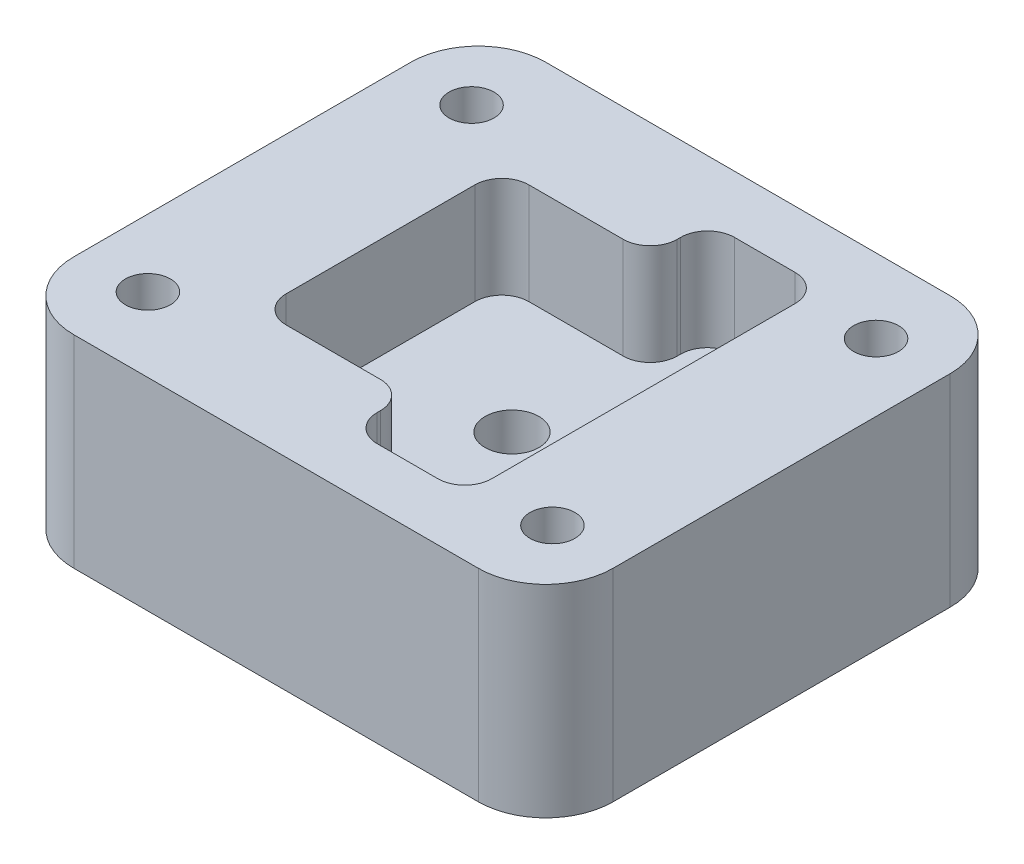
ISO-10303-21;
HEADER;
FILE_DESCRIPTION(('STEP AP214'),'2;1');
FILE_NAME('part.step','',(''),(''),'','','');
FILE_SCHEMA(('AUTOMOTIVE_DESIGN { 1 0 10303 214 1 1 1 1 }'));
ENDSEC;
DATA;
#1=APPLICATION_CONTEXT('core data for automotive mechanical design processes');
#2=APPLICATION_PROTOCOL_DEFINITION('international standard','automotive_design',2000,#1);
#3=PRODUCT_CONTEXT('',#1,'mechanical');
#4=PRODUCT('Part','Part','',(#3));
#5=PRODUCT_RELATED_PRODUCT_CATEGORY('part','',(#4));
#6=PRODUCT_DEFINITION_FORMATION('','',#4);
#7=PRODUCT_DEFINITION_CONTEXT('part definition',#1,'design');
#8=PRODUCT_DEFINITION('design','',#6,#7);
#9=PRODUCT_DEFINITION_SHAPE('','',#8);
#10=(LENGTH_UNIT() NAMED_UNIT(*) SI_UNIT(.MILLI.,.METRE.));
#11=(NAMED_UNIT(*) PLANE_ANGLE_UNIT() SI_UNIT($,.RADIAN.));
#12=(NAMED_UNIT(*) SI_UNIT($,.STERADIAN.) SOLID_ANGLE_UNIT());
#13=UNCERTAINTY_MEASURE_WITH_UNIT(LENGTH_MEASURE(1.E-05),#10,'distance_accuracy_value','');
#14=(GEOMETRIC_REPRESENTATION_CONTEXT(3) GLOBAL_UNCERTAINTY_ASSIGNED_CONTEXT((#13)) GLOBAL_UNIT_ASSIGNED_CONTEXT((#10,
#11,#12)) REPRESENTATION_CONTEXT('',''));
#15=CARTESIAN_POINT('',(0.,0.,0.));
#16=DIRECTION('',(0.,0.,1.));
#17=DIRECTION('',(1.,0.,0.));
#18=AXIS2_PLACEMENT_3D('',#15,#16,#17);
#19=CARTESIAN_POINT('',(20.,0.,-17.5));
#20=DIRECTION('',(0.,1.,0.));
#21=DIRECTION('',(0.,0.,1.));
#22=AXIS2_PLACEMENT_3D('',#19,#20,#21);
#23=CYLINDRICAL_SURFACE('',#22,2.);
#24=CARTESIAN_POINT('',(20.,7.5,-17.5));
#25=DIRECTION('',(0.,1.,0.));
#26=DIRECTION('',(0.,0.,1.));
#27=AXIS2_PLACEMENT_3D('',#24,#25,#26);
#28=CIRCLE('',#27,2.);
#29=CARTESIAN_POINT('',(20.,7.5,-15.5));
#30=VERTEX_POINT('',#29);
#31=EDGE_CURVE('E773',#30,#30,#28,.T.);
#32=ORIENTED_EDGE('',*,*,#31,.T.);
#33=EDGE_LOOP('',(#32));
#34=FACE_BOUND('',#33,.T.);
#35=CARTESIAN_POINT('',(20.,2.5,-17.5));
#36=DIRECTION('',(0.,-1.,0.));
#37=DIRECTION('',(0.,0.,-1.));
#38=AXIS2_PLACEMENT_3D('',#35,#36,#37);
#39=CIRCLE('',#38,2.);
#40=CARTESIAN_POINT('',(20.,2.5,-19.5));
#41=VERTEX_POINT('',#40);
#42=EDGE_CURVE('E42',#41,#41,#39,.F.);
#43=ORIENTED_EDGE('',*,*,#42,.F.);
#44=EDGE_LOOP('',(#43));
#45=FACE_BOUND('',#44,.T.);
#46=ADVANCED_FACE('F38',(#34,#45),#23,.F.);
#47=CARTESIAN_POINT('',(0.,15.,0.));
#48=DIRECTION('',(0.,-1.,0.));
#49=DIRECTION('',(0.,0.,-1.));
#50=AXIS2_PLACEMENT_3D('',#47,#48,#49);
#51=PLANE('',#50);
#52=DIRECTION('',(0.,0.,1.));
#53=VECTOR('',#52,1.);
#54=CARTESIAN_POINT('',(21.25,15.,-8.5));
#55=LINE('',#54,#53);
#56=CARTESIAN_POINT('',(21.25,15.,-6.5));
#57=VERTEX_POINT('',#56);
#58=CARTESIAN_POINT('',(21.25,15.,-6.25000000000003));
#59=VERTEX_POINT('',#58);
#60=EDGE_CURVE('E413',#57,#59,#55,.T.);
#61=ORIENTED_EDGE('',*,*,#60,.F.);
#62=CARTESIAN_POINT('',(19.25,15.,-6.5));
#63=DIRECTION('',(0.,-1.,0.));
#64=DIRECTION('',(0.,0.,-1.));
#65=AXIS2_PLACEMENT_3D('',#62,#63,#64);
#66=CIRCLE('',#65,2.);
#67=CARTESIAN_POINT('',(19.25,15.,-8.5));
#68=VERTEX_POINT('',#67);
#69=EDGE_CURVE('E364',#57,#68,#66,.F.);
#70=ORIENTED_EDGE('',*,*,#69,.T.);
#71=DIRECTION('',(1.,0.,0.));
#72=VECTOR('',#71,1.);
#73=CARTESIAN_POINT('',(10.25,15.,-8.5));
#74=LINE('',#73,#72);
#75=CARTESIAN_POINT('',(12.25,15.,-8.5));
#76=VERTEX_POINT('',#75);
#77=EDGE_CURVE('E412',#76,#68,#74,.T.);
#78=ORIENTED_EDGE('',*,*,#77,.F.);
#79=CARTESIAN_POINT('',(12.25,15.,-10.5));
#80=DIRECTION('',(0.,-1.,0.));
#81=DIRECTION('',(0.,0.,-1.));
#82=AXIS2_PLACEMENT_3D('',#79,#80,#81);
#83=CIRCLE('',#82,2.);
#84=CARTESIAN_POINT('',(10.25,15.,-10.5));
#85=VERTEX_POINT('',#84);
#86=EDGE_CURVE('E376',#76,#85,#83,.T.);
#87=ORIENTED_EDGE('',*,*,#86,.T.);
#88=DIRECTION('',(0.,0.,1.));
#89=VECTOR('',#88,1.);
#90=CARTESIAN_POINT('',(10.25,15.,-26.5));
#91=LINE('',#90,#89);
#92=CARTESIAN_POINT('',(10.25,15.,-24.5));
#93=VERTEX_POINT('',#92);
#94=EDGE_CURVE('E418',#93,#85,#91,.T.);
#95=ORIENTED_EDGE('',*,*,#94,.F.);
#96=CARTESIAN_POINT('',(12.25,15.,-24.5));
#97=DIRECTION('',(0.,-1.,0.));
#98=DIRECTION('',(0.,0.,-1.));
#99=AXIS2_PLACEMENT_3D('',#96,#97,#98);
#100=CIRCLE('',#99,2.);
#101=CARTESIAN_POINT('',(12.25,15.,-26.5));
#102=VERTEX_POINT('',#101);
#103=EDGE_CURVE('E373',#93,#102,#100,.T.);
#104=ORIENTED_EDGE('',*,*,#103,.T.);
#105=DIRECTION('',(-1.,0.,0.));
#106=VECTOR('',#105,1.);
#107=CARTESIAN_POINT('',(21.25,15.,-26.5));
#108=LINE('',#107,#106);
#109=CARTESIAN_POINT('',(19.25,15.,-26.5));
#110=VERTEX_POINT('',#109);
#111=EDGE_CURVE('E425',#110,#102,#108,.T.);
#112=ORIENTED_EDGE('',*,*,#111,.F.);
#113=CARTESIAN_POINT('',(19.25,15.,-28.5));
#114=DIRECTION('',(0.,-1.,0.));
#115=DIRECTION('',(0.,0.,-1.));
#116=AXIS2_PLACEMENT_3D('',#113,#114,#115);
#117=CIRCLE('',#116,2.);
#118=CARTESIAN_POINT('',(21.25,15.,-28.5));
#119=VERTEX_POINT('',#118);
#120=EDGE_CURVE('E55',#110,#119,#117,.F.);
#121=ORIENTED_EDGE('',*,*,#120,.T.);
#122=DIRECTION('',(0.,0.,1.));
#123=VECTOR('',#122,1.);
#124=CARTESIAN_POINT('',(21.25,15.,-26.5));
#125=LINE('',#124,#123);
#126=CARTESIAN_POINT('',(21.25,15.,-28.75));
#127=VERTEX_POINT('',#126);
#128=EDGE_CURVE('E776',#127,#119,#125,.T.);
#129=ORIENTED_EDGE('',*,*,#128,.F.);
#130=CARTESIAN_POINT('',(23.25,15.,-28.75));
#131=DIRECTION('',(0.,-1.,0.));
#132=DIRECTION('',(0.,0.,-1.));
#133=AXIS2_PLACEMENT_3D('',#130,#131,#132);
#134=CIRCLE('',#133,2.);
#135=CARTESIAN_POINT('',(23.25,15.,-30.75));
#136=VERTEX_POINT('',#135);
#137=EDGE_CURVE('E63',#127,#136,#134,.T.);
#138=ORIENTED_EDGE('',*,*,#137,.T.);
#139=DIRECTION('',(-1.,0.,0.));
#140=VECTOR('',#139,1.);
#141=CARTESIAN_POINT('',(29.75,15.,-30.75));
#142=LINE('',#141,#140);
#143=CARTESIAN_POINT('',(27.75,15.,-30.75));
#144=VERTEX_POINT('',#143);
#145=EDGE_CURVE('E436',#144,#136,#142,.T.);
#146=ORIENTED_EDGE('',*,*,#145,.F.);
#147=CARTESIAN_POINT('',(27.75,15.,-28.75));
#148=DIRECTION('',(0.,-1.,0.));
#149=DIRECTION('',(0.,0.,-1.));
#150=AXIS2_PLACEMENT_3D('',#147,#148,#149);
#151=CIRCLE('',#150,2.);
#152=CARTESIAN_POINT('',(29.75,15.,-28.75));
#153=VERTEX_POINT('',#152);
#154=EDGE_CURVE('E370',#144,#153,#151,.T.);
#155=ORIENTED_EDGE('',*,*,#154,.T.);
#156=DIRECTION('',(0.,0.,-1.));
#157=VECTOR('',#156,1.);
#158=CARTESIAN_POINT('',(29.75,15.,-4.25));
#159=LINE('',#158,#157);
#160=CARTESIAN_POINT('',(29.75,15.,-6.25000000000001));
#161=VERTEX_POINT('',#160);
#162=EDGE_CURVE('E432',#161,#153,#159,.T.);
#163=ORIENTED_EDGE('',*,*,#162,.F.);
#164=CARTESIAN_POINT('',(27.75,15.,-6.25000000000001));
#165=DIRECTION('',(0.,-1.,0.));
#166=DIRECTION('',(0.,0.,-1.));
#167=AXIS2_PLACEMENT_3D('',#164,#165,#166);
#168=CIRCLE('',#167,2.);
#169=CARTESIAN_POINT('',(27.75,15.,-4.25000000000001));
#170=VERTEX_POINT('',#169);
#171=EDGE_CURVE('E367',#161,#170,#168,.T.);
#172=ORIENTED_EDGE('',*,*,#171,.T.);
#173=DIRECTION('',(1.,0.,0.));
#174=VECTOR('',#173,1.);
#175=CARTESIAN_POINT('',(21.25,15.,-4.25000000000003));
#176=LINE('',#175,#174);
#177=CARTESIAN_POINT('',(23.25,15.,-4.25000000000003));
#178=VERTEX_POINT('',#177);
#179=EDGE_CURVE('E422',#178,#170,#176,.T.);
#180=ORIENTED_EDGE('',*,*,#179,.F.);
#181=CARTESIAN_POINT('',(23.25,15.,-6.25000000000003));
#182=DIRECTION('',(0.,-1.,0.));
#183=DIRECTION('',(0.,0.,-1.));
#184=AXIS2_PLACEMENT_3D('',#181,#182,#183);
#185=CIRCLE('',#184,2.);
#186=EDGE_CURVE('E379',#178,#59,#185,.T.);
#187=ORIENTED_EDGE('',*,*,#186,.T.);
#188=EDGE_LOOP('',(#61,#70,#78,#87,#95,#104,#112,#121,#129,#138,#146,#155,#163,#172,#180,#187));
#189=FACE_BOUND('',#188,.T.);
#190=DIRECTION('',(0.,0.,1.));
#191=VECTOR('',#190,1.);
#192=CARTESIAN_POINT('',(0.,15.,0.));
#193=LINE('',#192,#191);
#194=CARTESIAN_POINT('',(0.,15.,-30.));
#195=VERTEX_POINT('',#194);
#196=CARTESIAN_POINT('',(0.,15.,-5.));
#197=VERTEX_POINT('',#196);
#198=EDGE_CURVE('E247',#195,#197,#193,.T.);
#199=ORIENTED_EDGE('',*,*,#198,.T.);
#200=CARTESIAN_POINT('',(5.,15.,-5.));
#201=DIRECTION('',(0.,-1.,0.));
#202=DIRECTION('',(0.,0.,-1.));
#203=AXIS2_PLACEMENT_3D('',#200,#201,#202);
#204=CIRCLE('',#203,5.);
#205=CARTESIAN_POINT('',(5.,15.,0.));
#206=VERTEX_POINT('',#205);
#207=EDGE_CURVE('E272',#197,#206,#204,.F.);
#208=ORIENTED_EDGE('',*,*,#207,.T.);
#209=DIRECTION('',(1.,0.,0.));
#210=VECTOR('',#209,1.);
#211=CARTESIAN_POINT('',(0.,15.,0.));
#212=LINE('',#211,#210);
#213=CARTESIAN_POINT('',(35.,15.,0.));
#214=VERTEX_POINT('',#213);
#215=EDGE_CURVE('E223',#206,#214,#212,.T.);
#216=ORIENTED_EDGE('',*,*,#215,.T.);
#217=CARTESIAN_POINT('',(35.,15.,-5.));
#218=DIRECTION('',(0.,-1.,0.));
#219=DIRECTION('',(0.,0.,-1.));
#220=AXIS2_PLACEMENT_3D('',#217,#218,#219);
#221=CIRCLE('',#220,5.);
#222=CARTESIAN_POINT('',(40.,15.,-5.));
#223=VERTEX_POINT('',#222);
#224=EDGE_CURVE('E263',#214,#223,#221,.F.);
#225=ORIENTED_EDGE('',*,*,#224,.T.);
#226=DIRECTION('',(0.,0.,-1.));
#227=VECTOR('',#226,1.);
#228=CARTESIAN_POINT('',(40.,15.,0.));
#229=LINE('',#228,#227);
#230=CARTESIAN_POINT('',(40.,15.,-30.));
#231=VERTEX_POINT('',#230);
#232=EDGE_CURVE('E478',#223,#231,#229,.T.);
#233=ORIENTED_EDGE('',*,*,#232,.T.);
#234=CARTESIAN_POINT('',(35.,15.,-30.));
#235=DIRECTION('',(0.,-1.,0.));
#236=DIRECTION('',(0.,0.,-1.));
#237=AXIS2_PLACEMENT_3D('',#234,#235,#236);
#238=CIRCLE('',#237,5.);
#239=CARTESIAN_POINT('',(35.,15.,-35.));
#240=VERTEX_POINT('',#239);
#241=EDGE_CURVE('E266',#231,#240,#238,.F.);
#242=ORIENTED_EDGE('',*,*,#241,.T.);
#243=DIRECTION('',(-1.,0.,0.));
#244=VECTOR('',#243,1.);
#245=CARTESIAN_POINT('',(0.,15.,-35.));
#246=LINE('',#245,#244);
#247=CARTESIAN_POINT('',(5.,15.,-35.));
#248=VERTEX_POINT('',#247);
#249=EDGE_CURVE('E249',#240,#248,#246,.T.);
#250=ORIENTED_EDGE('',*,*,#249,.T.);
#251=CARTESIAN_POINT('',(5.,15.,-30.));
#252=DIRECTION('',(0.,-1.,0.));
#253=DIRECTION('',(0.,0.,-1.));
#254=AXIS2_PLACEMENT_3D('',#251,#252,#253);
#255=CIRCLE('',#254,5.);
#256=EDGE_CURVE('E269',#248,#195,#255,.F.);
#257=ORIENTED_EDGE('',*,*,#256,.T.);
#258=EDGE_LOOP('',(#199,#208,#216,#225,#233,#242,#250,#257));
#259=FACE_BOUND('',#258,.T.);
#260=CARTESIAN_POINT('',(5.,15.,-29.5));
#261=DIRECTION('',(0.,1.,0.));
#262=DIRECTION('',(0.,0.,1.));
#263=AXIS2_PLACEMENT_3D('',#260,#261,#262);
#264=CIRCLE('',#263,1.66666666666667);
#265=CARTESIAN_POINT('',(5.,15.,-27.8333333333333));
#266=VERTEX_POINT('',#265);
#267=EDGE_CURVE('E240',#266,#266,#264,.T.);
#268=ORIENTED_EDGE('',*,*,#267,.F.);
#269=EDGE_LOOP('',(#268));
#270=FACE_BOUND('',#269,.T.);
#271=CARTESIAN_POINT('',(35.,15.,-29.5));
#272=DIRECTION('',(0.,1.,0.));
#273=DIRECTION('',(0.,0.,1.));
#274=AXIS2_PLACEMENT_3D('',#271,#272,#273);
#275=CIRCLE('',#274,1.66666666666666);
#276=CARTESIAN_POINT('',(35.,15.,-27.8333333333333));
#277=VERTEX_POINT('',#276);
#278=EDGE_CURVE('E459',#277,#277,#275,.T.);
#279=ORIENTED_EDGE('',*,*,#278,.F.);
#280=EDGE_LOOP('',(#279));
#281=FACE_BOUND('',#280,.T.);
#282=CARTESIAN_POINT('',(5.,15.,-5.5));
#283=DIRECTION('',(0.,1.,0.));
#284=DIRECTION('',(0.,0.,1.));
#285=AXIS2_PLACEMENT_3D('',#282,#283,#284);
#286=CIRCLE('',#285,1.66666666666667);
#287=CARTESIAN_POINT('',(5.,15.,-3.83333333333333));
#288=VERTEX_POINT('',#287);
#289=EDGE_CURVE('E451',#288,#288,#286,.T.);
#290=ORIENTED_EDGE('',*,*,#289,.F.);
#291=EDGE_LOOP('',(#290));
#292=FACE_BOUND('',#291,.T.);
#293=CARTESIAN_POINT('',(35.,15.,-5.5));
#294=DIRECTION('',(0.,1.,0.));
#295=DIRECTION('',(0.,0.,1.));
#296=AXIS2_PLACEMENT_3D('',#293,#294,#295);
#297=CIRCLE('',#296,1.66666666666666);
#298=CARTESIAN_POINT('',(35.,15.,-3.83333333333334));
#299=VERTEX_POINT('',#298);
#300=EDGE_CURVE('E441',#299,#299,#297,.T.);
#301=ORIENTED_EDGE('',*,*,#300,.F.);
#302=EDGE_LOOP('',(#301));
#303=FACE_BOUND('',#302,.T.);
#304=ADVANCED_FACE('F410',(#189,#259,#270,#281,#292,#303),#51,.F.);
#305=CARTESIAN_POINT('',(0.,0.,0.));
#306=DIRECTION('',(0.,-1.,0.));
#307=DIRECTION('',(0.,0.,-1.));
#308=AXIS2_PLACEMENT_3D('',#305,#306,#307);
#309=PLANE('',#308);
#310=CARTESIAN_POINT('',(20.,0.,-17.5));
#311=DIRECTION('',(0.,-1.,0.));
#312=DIRECTION('',(0.,0.,-1.));
#313=AXIS2_PLACEMENT_3D('',#310,#311,#312);
#314=CIRCLE('',#313,5.);
#315=CARTESIAN_POINT('',(20.,0.,-22.5));
#316=VERTEX_POINT('',#315);
#317=EDGE_CURVE('E767',#316,#316,#314,.T.);
#318=ORIENTED_EDGE('',*,*,#317,.F.);
#319=EDGE_LOOP('',(#318));
#320=FACE_BOUND('',#319,.T.);
#321=CARTESIAN_POINT('',(5.,0.,-5.5));
#322=DIRECTION('',(0.,1.,0.));
#323=DIRECTION('',(0.,0.,1.));
#324=AXIS2_PLACEMENT_3D('',#321,#322,#323);
#325=CIRCLE('',#324,1.66666666666667);
#326=CARTESIAN_POINT('',(5.,0.,-3.83333333333333));
#327=VERTEX_POINT('',#326);
#328=EDGE_CURVE('E445',#327,#327,#325,.T.);
#329=ORIENTED_EDGE('',*,*,#328,.T.);
#330=EDGE_LOOP('',(#329));
#331=FACE_BOUND('',#330,.T.);
#332=CARTESIAN_POINT('',(5.,0.,-29.5));
#333=DIRECTION('',(0.,1.,0.));
#334=DIRECTION('',(0.,0.,1.));
#335=AXIS2_PLACEMENT_3D('',#332,#333,#334);
#336=CIRCLE('',#335,1.66666666666667);
#337=CARTESIAN_POINT('',(5.,0.,-27.8333333333333));
#338=VERTEX_POINT('',#337);
#339=EDGE_CURVE('E463',#338,#338,#336,.T.);
#340=ORIENTED_EDGE('',*,*,#339,.T.);
#341=EDGE_LOOP('',(#340));
#342=FACE_BOUND('',#341,.T.);
#343=DIRECTION('',(1.,0.,0.));
#344=VECTOR('',#343,1.);
#345=CARTESIAN_POINT('',(0.,0.,0.));
#346=LINE('',#345,#344);
#347=CARTESIAN_POINT('',(5.,0.,0.));
#348=VERTEX_POINT('',#347);
#349=CARTESIAN_POINT('',(35.,0.,0.));
#350=VERTEX_POINT('',#349);
#351=EDGE_CURVE('E220',#348,#350,#346,.T.);
#352=ORIENTED_EDGE('',*,*,#351,.F.);
#353=CARTESIAN_POINT('',(5.,0.,-5.));
#354=DIRECTION('',(0.,-1.,0.));
#355=DIRECTION('',(0.,0.,-1.));
#356=AXIS2_PLACEMENT_3D('',#353,#354,#355);
#357=CIRCLE('',#356,5.);
#358=CARTESIAN_POINT('',(0.,0.,-5.));
#359=VERTEX_POINT('',#358);
#360=EDGE_CURVE('E202',#348,#359,#357,.T.);
#361=ORIENTED_EDGE('',*,*,#360,.T.);
#362=DIRECTION('',(0.,0.,1.));
#363=VECTOR('',#362,1.);
#364=CARTESIAN_POINT('',(0.,0.,0.));
#365=LINE('',#364,#363);
#366=CARTESIAN_POINT('',(0.,0.,-30.));
#367=VERTEX_POINT('',#366);
#368=EDGE_CURVE('E233',#367,#359,#365,.T.);
#369=ORIENTED_EDGE('',*,*,#368,.F.);
#370=CARTESIAN_POINT('',(5.,0.,-30.));
#371=DIRECTION('',(0.,-1.,0.));
#372=DIRECTION('',(0.,0.,-1.));
#373=AXIS2_PLACEMENT_3D('',#370,#371,#372);
#374=CIRCLE('',#373,5.);
#375=CARTESIAN_POINT('',(5.,0.,-35.));
#376=VERTEX_POINT('',#375);
#377=EDGE_CURVE('E214',#367,#376,#374,.T.);
#378=ORIENTED_EDGE('',*,*,#377,.T.);
#379=DIRECTION('',(-1.,0.,0.));
#380=VECTOR('',#379,1.);
#381=CARTESIAN_POINT('',(0.,0.,-35.));
#382=LINE('',#381,#380);
#383=CARTESIAN_POINT('',(35.,0.,-35.));
#384=VERTEX_POINT('',#383);
#385=EDGE_CURVE('E238',#384,#376,#382,.T.);
#386=ORIENTED_EDGE('',*,*,#385,.F.);
#387=CARTESIAN_POINT('',(35.,0.,-30.));
#388=DIRECTION('',(0.,-1.,0.));
#389=DIRECTION('',(0.,0.,-1.));
#390=AXIS2_PLACEMENT_3D('',#387,#388,#389);
#391=CIRCLE('',#390,5.);
#392=CARTESIAN_POINT('',(40.,0.,-30.));
#393=VERTEX_POINT('',#392);
#394=EDGE_CURVE('E253',#384,#393,#391,.T.);
#395=ORIENTED_EDGE('',*,*,#394,.T.);
#396=DIRECTION('',(0.,0.,-1.));
#397=VECTOR('',#396,1.);
#398=CARTESIAN_POINT('',(40.,0.,0.));
#399=LINE('',#398,#397);
#400=CARTESIAN_POINT('',(40.,0.,-5.));
#401=VERTEX_POINT('',#400);
#402=EDGE_CURVE('E232',#401,#393,#399,.T.);
#403=ORIENTED_EDGE('',*,*,#402,.F.);
#404=CARTESIAN_POINT('',(35.,0.,-5.));
#405=DIRECTION('',(0.,-1.,0.));
#406=DIRECTION('',(0.,0.,-1.));
#407=AXIS2_PLACEMENT_3D('',#404,#405,#406);
#408=CIRCLE('',#407,5.);
#409=EDGE_CURVE('E225',#401,#350,#408,.T.);
#410=ORIENTED_EDGE('',*,*,#409,.T.);
#411=EDGE_LOOP('',(#352,#361,#369,#378,#386,#395,#403,#410));
#412=FACE_BOUND('',#411,.T.);
#413=CARTESIAN_POINT('',(35.,0.,-29.5));
#414=DIRECTION('',(0.,1.,0.));
#415=DIRECTION('',(0.,0.,1.));
#416=AXIS2_PLACEMENT_3D('',#413,#414,#415);
#417=CIRCLE('',#416,1.66666666666666);
#418=CARTESIAN_POINT('',(35.,0.,-27.8333333333333));
#419=VERTEX_POINT('',#418);
#420=EDGE_CURVE('E455',#419,#419,#417,.T.);
#421=ORIENTED_EDGE('',*,*,#420,.T.);
#422=EDGE_LOOP('',(#421));
#423=FACE_BOUND('',#422,.T.);
#424=CARTESIAN_POINT('',(35.,0.,-5.5));
#425=DIRECTION('',(0.,1.,0.));
#426=DIRECTION('',(0.,0.,1.));
#427=AXIS2_PLACEMENT_3D('',#424,#425,#426);
#428=CIRCLE('',#427,1.66666666666666);
#429=CARTESIAN_POINT('',(35.,0.,-3.83333333333334));
#430=VERTEX_POINT('',#429);
#431=EDGE_CURVE('E446',#430,#430,#428,.T.);
#432=ORIENTED_EDGE('',*,*,#431,.T.);
#433=EDGE_LOOP('',(#432));
#434=FACE_BOUND('',#433,.T.);
#435=ADVANCED_FACE('F228',(#320,#331,#342,#412,#423,#434),#309,.T.);
#436=CARTESIAN_POINT('',(0.,15.,0.));
#437=DIRECTION('',(1.,0.,0.));
#438=DIRECTION('',(0.,0.,-1.));
#439=AXIS2_PLACEMENT_3D('',#436,#437,#438);
#440=PLANE('',#439);
#441=ORIENTED_EDGE('',*,*,#368,.T.);
#442=DIRECTION('',(0.,-1.,0.));
#443=VECTOR('',#442,1.);
#444=CARTESIAN_POINT('',(0.,15.,-5.));
#445=LINE('',#444,#443);
#446=EDGE_CURVE('E207',#359,#197,#445,.F.);
#447=ORIENTED_EDGE('',*,*,#446,.T.);
#448=ORIENTED_EDGE('',*,*,#198,.F.);
#449=DIRECTION('',(0.,-1.,0.));
#450=VECTOR('',#449,1.);
#451=CARTESIAN_POINT('',(0.,15.,-30.));
#452=LINE('',#451,#450);
#453=EDGE_CURVE('E213',#195,#367,#452,.T.);
#454=ORIENTED_EDGE('',*,*,#453,.T.);
#455=EDGE_LOOP('',(#441,#447,#448,#454));
#456=FACE_BOUND('',#455,.T.);
#457=ADVANCED_FACE('F495',(#456),#440,.F.);
#458=CARTESIAN_POINT('',(0.,15.,0.));
#459=DIRECTION('',(0.,0.,-1.));
#460=DIRECTION('',(-1.,0.,0.));
#461=AXIS2_PLACEMENT_3D('',#458,#459,#460);
#462=PLANE('',#461);
#463=ORIENTED_EDGE('',*,*,#215,.F.);
#464=DIRECTION('',(0.,-1.,0.));
#465=VECTOR('',#464,1.);
#466=CARTESIAN_POINT('',(5.,15.,0.));
#467=LINE('',#466,#465);
#468=EDGE_CURVE('E206',#206,#348,#467,.T.);
#469=ORIENTED_EDGE('',*,*,#468,.T.);
#470=ORIENTED_EDGE('',*,*,#351,.T.);
#471=DIRECTION('',(0.,-1.,0.));
#472=VECTOR('',#471,1.);
#473=CARTESIAN_POINT('',(35.,15.,0.));
#474=LINE('',#473,#472);
#475=EDGE_CURVE('E226',#350,#214,#474,.F.);
#476=ORIENTED_EDGE('',*,*,#475,.T.);
#477=EDGE_LOOP('',(#463,#469,#470,#476));
#478=FACE_BOUND('',#477,.T.);
#479=ADVANCED_FACE('F219',(#478),#462,.F.);
#480=CARTESIAN_POINT('',(40.,15.,0.));
#481=DIRECTION('',(-1.,0.,0.));
#482=DIRECTION('',(0.,0.,1.));
#483=AXIS2_PLACEMENT_3D('',#480,#481,#482);
#484=PLANE('',#483);
#485=ORIENTED_EDGE('',*,*,#402,.T.);
#486=DIRECTION('',(0.,-1.,0.));
#487=VECTOR('',#486,1.);
#488=CARTESIAN_POINT('',(40.,15.,-30.));
#489=LINE('',#488,#487);
#490=EDGE_CURVE('E286',#393,#231,#489,.F.);
#491=ORIENTED_EDGE('',*,*,#490,.T.);
#492=ORIENTED_EDGE('',*,*,#232,.F.);
#493=DIRECTION('',(0.,-1.,0.));
#494=VECTOR('',#493,1.);
#495=CARTESIAN_POINT('',(40.,15.,-5.));
#496=LINE('',#495,#494);
#497=EDGE_CURVE('E282',#223,#401,#496,.T.);
#498=ORIENTED_EDGE('',*,*,#497,.T.);
#499=EDGE_LOOP('',(#485,#491,#492,#498));
#500=FACE_BOUND('',#499,.T.);
#501=ADVANCED_FACE('F502',(#500),#484,.F.);
#502=CARTESIAN_POINT('',(0.,15.,-35.));
#503=DIRECTION('',(0.,0.,1.));
#504=DIRECTION('',(1.,0.,0.));
#505=AXIS2_PLACEMENT_3D('',#502,#503,#504);
#506=PLANE('',#505);
#507=ORIENTED_EDGE('',*,*,#385,.T.);
#508=DIRECTION('',(0.,-1.,0.));
#509=VECTOR('',#508,1.);
#510=CARTESIAN_POINT('',(5.,15.,-35.));
#511=LINE('',#510,#509);
#512=EDGE_CURVE('E279',#376,#248,#511,.F.);
#513=ORIENTED_EDGE('',*,*,#512,.T.);
#514=ORIENTED_EDGE('',*,*,#249,.F.);
#515=DIRECTION('',(0.,-1.,0.));
#516=VECTOR('',#515,1.);
#517=CARTESIAN_POINT('',(35.,15.,-35.));
#518=LINE('',#517,#516);
#519=EDGE_CURVE('E275',#240,#384,#518,.T.);
#520=ORIENTED_EDGE('',*,*,#519,.T.);
#521=EDGE_LOOP('',(#507,#513,#514,#520));
#522=FACE_BOUND('',#521,.T.);
#523=ADVANCED_FACE('F497',(#522),#506,.F.);
#524=CARTESIAN_POINT('',(5.,15.,-29.5));
#525=DIRECTION('',(0.,-1.,0.));
#526=DIRECTION('',(0.,0.,-1.));
#527=AXIS2_PLACEMENT_3D('',#524,#525,#526);
#528=CYLINDRICAL_SURFACE('',#527,1.66666666666667);
#529=ORIENTED_EDGE('',*,*,#267,.T.);
#530=EDGE_LOOP('',(#529));
#531=FACE_BOUND('',#530,.T.);
#532=ORIENTED_EDGE('',*,*,#339,.F.);
#533=EDGE_LOOP('',(#532));
#534=FACE_BOUND('',#533,.T.);
#535=ADVANCED_FACE('F571',(#531,#534),#528,.F.);
#536=CARTESIAN_POINT('',(35.,15.,-29.5));
#537=DIRECTION('',(0.,-1.,0.));
#538=DIRECTION('',(0.,0.,-1.));
#539=AXIS2_PLACEMENT_3D('',#536,#537,#538);
#540=CYLINDRICAL_SURFACE('',#539,1.66666666666666);
#541=ORIENTED_EDGE('',*,*,#278,.T.);
#542=EDGE_LOOP('',(#541));
#543=FACE_BOUND('',#542,.T.);
#544=ORIENTED_EDGE('',*,*,#420,.F.);
#545=EDGE_LOOP('',(#544));
#546=FACE_BOUND('',#545,.T.);
#547=ADVANCED_FACE('F567',(#543,#546),#540,.F.);
#548=CARTESIAN_POINT('',(5.,15.,-5.5));
#549=DIRECTION('',(0.,-1.,0.));
#550=DIRECTION('',(0.,0.,-1.));
#551=AXIS2_PLACEMENT_3D('',#548,#549,#550);
#552=CYLINDRICAL_SURFACE('',#551,1.66666666666667);
#553=ORIENTED_EDGE('',*,*,#289,.T.);
#554=EDGE_LOOP('',(#553));
#555=FACE_BOUND('',#554,.T.);
#556=ORIENTED_EDGE('',*,*,#328,.F.);
#557=EDGE_LOOP('',(#556));
#558=FACE_BOUND('',#557,.T.);
#559=ADVANCED_FACE('F563',(#555,#558),#552,.F.);
#560=CARTESIAN_POINT('',(35.,15.,-5.5));
#561=DIRECTION('',(0.,-1.,0.));
#562=DIRECTION('',(0.,0.,-1.));
#563=AXIS2_PLACEMENT_3D('',#560,#561,#562);
#564=CYLINDRICAL_SURFACE('',#563,1.66666666666666);
#565=ORIENTED_EDGE('',*,*,#300,.T.);
#566=EDGE_LOOP('',(#565));
#567=FACE_BOUND('',#566,.T.);
#568=ORIENTED_EDGE('',*,*,#431,.F.);
#569=EDGE_LOOP('',(#568));
#570=FACE_BOUND('',#569,.T.);
#571=ADVANCED_FACE('F560',(#567,#570),#564,.F.);
#572=CARTESIAN_POINT('',(5.,15.,-5.));
#573=DIRECTION('',(0.,-1.,0.));
#574=DIRECTION('',(0.,0.,-1.));
#575=AXIS2_PLACEMENT_3D('',#572,#573,#574);
#576=CYLINDRICAL_SURFACE('',#575,5.);
#577=ORIENTED_EDGE('',*,*,#207,.F.);
#578=ORIENTED_EDGE('',*,*,#446,.F.);
#579=ORIENTED_EDGE('',*,*,#360,.F.);
#580=ORIENTED_EDGE('',*,*,#468,.F.);
#581=EDGE_LOOP('',(#577,#578,#579,#580));
#582=FACE_BOUND('',#581,.T.);
#583=ADVANCED_FACE('F205',(#582),#576,.T.);
#584=CARTESIAN_POINT('',(5.,15.,-30.));
#585=DIRECTION('',(0.,-1.,0.));
#586=DIRECTION('',(0.,0.,-1.));
#587=AXIS2_PLACEMENT_3D('',#584,#585,#586);
#588=CYLINDRICAL_SURFACE('',#587,5.);
#589=ORIENTED_EDGE('',*,*,#256,.F.);
#590=ORIENTED_EDGE('',*,*,#512,.F.);
#591=ORIENTED_EDGE('',*,*,#377,.F.);
#592=ORIENTED_EDGE('',*,*,#453,.F.);
#593=EDGE_LOOP('',(#589,#590,#591,#592));
#594=FACE_BOUND('',#593,.T.);
#595=ADVANCED_FACE('F493',(#594),#588,.T.);
#596=CARTESIAN_POINT('',(35.,15.,-30.));
#597=DIRECTION('',(0.,-1.,0.));
#598=DIRECTION('',(0.,0.,-1.));
#599=AXIS2_PLACEMENT_3D('',#596,#597,#598);
#600=CYLINDRICAL_SURFACE('',#599,5.);
#601=ORIENTED_EDGE('',*,*,#241,.F.);
#602=ORIENTED_EDGE('',*,*,#490,.F.);
#603=ORIENTED_EDGE('',*,*,#394,.F.);
#604=ORIENTED_EDGE('',*,*,#519,.F.);
#605=EDGE_LOOP('',(#601,#602,#603,#604));
#606=FACE_BOUND('',#605,.T.);
#607=ADVANCED_FACE('F499',(#606),#600,.T.);
#608=CARTESIAN_POINT('',(35.,15.,-5.));
#609=DIRECTION('',(0.,-1.,0.));
#610=DIRECTION('',(0.,0.,-1.));
#611=AXIS2_PLACEMENT_3D('',#608,#609,#610);
#612=CYLINDRICAL_SURFACE('',#611,5.);
#613=ORIENTED_EDGE('',*,*,#224,.F.);
#614=ORIENTED_EDGE('',*,*,#475,.F.);
#615=ORIENTED_EDGE('',*,*,#409,.F.);
#616=ORIENTED_EDGE('',*,*,#497,.F.);
#617=EDGE_LOOP('',(#613,#614,#615,#616));
#618=FACE_BOUND('',#617,.T.);
#619=ADVANCED_FACE('F507',(#618),#612,.T.);
#620=CARTESIAN_POINT('',(21.25,7.5,-26.5));
#621=DIRECTION('',(-1.,0.,0.));
#622=DIRECTION('',(0.,0.,1.));
#623=AXIS2_PLACEMENT_3D('',#620,#621,#622);
#624=PLANE('',#623);
#625=DIRECTION('',(0.,0.,1.));
#626=VECTOR('',#625,1.);
#627=CARTESIAN_POINT('',(21.25,7.5,-26.5));
#628=LINE('',#627,#626);
#629=CARTESIAN_POINT('',(21.25,7.5,-28.75));
#630=VERTEX_POINT('',#629);
#631=CARTESIAN_POINT('',(21.25,7.5,-28.5));
#632=VERTEX_POINT('',#631);
#633=EDGE_CURVE('E440',#630,#632,#628,.T.);
#634=ORIENTED_EDGE('',*,*,#633,.F.);
#635=DIRECTION('',(0.,1.,0.));
#636=VECTOR('',#635,1.);
#637=CARTESIAN_POINT('',(21.25,15.,-28.75));
#638=LINE('',#637,#636);
#639=EDGE_CURVE('E359',#630,#127,#638,.T.);
#640=ORIENTED_EDGE('',*,*,#639,.T.);
#641=ORIENTED_EDGE('',*,*,#128,.T.);
#642=DIRECTION('',(0.,1.,0.));
#643=VECTOR('',#642,1.);
#644=CARTESIAN_POINT('',(21.25,7.5,-28.5));
#645=LINE('',#644,#643);
#646=EDGE_CURVE('E356',#119,#632,#645,.F.);
#647=ORIENTED_EDGE('',*,*,#646,.T.);
#648=EDGE_LOOP('',(#634,#640,#641,#647));
#649=FACE_BOUND('',#648,.T.);
#650=ADVANCED_FACE('F509',(#649),#624,.F.);
#651=CARTESIAN_POINT('',(29.75,7.5,-30.75));
#652=DIRECTION('',(0.,0.,-1.));
#653=DIRECTION('',(-1.,0.,0.));
#654=AXIS2_PLACEMENT_3D('',#651,#652,#653);
#655=PLANE('',#654);
#656=DIRECTION('',(-1.,0.,0.));
#657=VECTOR('',#656,1.);
#658=CARTESIAN_POINT('',(29.75,7.5,-30.75));
#659=LINE('',#658,#657);
#660=CARTESIAN_POINT('',(27.75,7.5,-30.75));
#661=VERTEX_POINT('',#660);
#662=CARTESIAN_POINT('',(23.25,7.5,-30.75));
#663=VERTEX_POINT('',#662);
#664=EDGE_CURVE('E450',#661,#663,#659,.T.);
#665=ORIENTED_EDGE('',*,*,#664,.F.);
#666=DIRECTION('',(0.,1.,0.));
#667=VECTOR('',#666,1.);
#668=CARTESIAN_POINT('',(27.75,15.,-30.75));
#669=LINE('',#668,#667);
#670=EDGE_CURVE('E324',#661,#144,#669,.T.);
#671=ORIENTED_EDGE('',*,*,#670,.T.);
#672=ORIENTED_EDGE('',*,*,#145,.T.);
#673=DIRECTION('',(0.,1.,0.));
#674=VECTOR('',#673,1.);
#675=CARTESIAN_POINT('',(23.25,7.5,-30.75));
#676=LINE('',#675,#674);
#677=EDGE_CURVE('E321',#136,#663,#676,.F.);
#678=ORIENTED_EDGE('',*,*,#677,.T.);
#679=EDGE_LOOP('',(#665,#671,#672,#678));
#680=FACE_BOUND('',#679,.T.);
#681=ADVANCED_FACE('F516',(#680),#655,.F.);
#682=CARTESIAN_POINT('',(29.75,7.5,-4.25));
#683=DIRECTION('',(1.,0.,0.));
#684=DIRECTION('',(0.,0.,-1.));
#685=AXIS2_PLACEMENT_3D('',#682,#683,#684);
#686=PLANE('',#685);
#687=DIRECTION('',(0.,0.,-1.));
#688=VECTOR('',#687,1.);
#689=CARTESIAN_POINT('',(29.75,7.5,-4.25));
#690=LINE('',#689,#688);
#691=CARTESIAN_POINT('',(29.75,7.5,-6.25000000000001));
#692=VERTEX_POINT('',#691);
#693=CARTESIAN_POINT('',(29.75,7.5,-28.75));
#694=VERTEX_POINT('',#693);
#695=EDGE_CURVE('E792',#692,#694,#690,.T.);
#696=ORIENTED_EDGE('',*,*,#695,.F.);
#697=DIRECTION('',(0.,1.,0.));
#698=VECTOR('',#697,1.);
#699=CARTESIAN_POINT('',(29.75,15.,-6.25000000000001));
#700=LINE('',#699,#698);
#701=EDGE_CURVE('E292',#692,#161,#700,.T.);
#702=ORIENTED_EDGE('',*,*,#701,.T.);
#703=ORIENTED_EDGE('',*,*,#162,.T.);
#704=DIRECTION('',(0.,1.,0.));
#705=VECTOR('',#704,1.);
#706=CARTESIAN_POINT('',(29.75,7.5,-28.75));
#707=LINE('',#706,#705);
#708=EDGE_CURVE('E289',#153,#694,#707,.F.);
#709=ORIENTED_EDGE('',*,*,#708,.T.);
#710=EDGE_LOOP('',(#696,#702,#703,#709));
#711=FACE_BOUND('',#710,.T.);
#712=ADVANCED_FACE('F540',(#711),#686,.F.);
#713=CARTESIAN_POINT('',(21.25,7.5,-4.25000000000003));
#714=DIRECTION('',(0.,0.,1.));
#715=DIRECTION('',(1.,0.,0.));
#716=AXIS2_PLACEMENT_3D('',#713,#714,#715);
#717=PLANE('',#716);
#718=ORIENTED_EDGE('',*,*,#179,.T.);
#719=DIRECTION('',(0.,1.,0.));
#720=VECTOR('',#719,1.);
#721=CARTESIAN_POINT('',(27.75,7.5,-4.25000000000001));
#722=LINE('',#721,#720);
#723=CARTESIAN_POINT('',(27.75,7.5,-4.25000000000001));
#724=VERTEX_POINT('',#723);
#725=EDGE_CURVE('E300',#170,#724,#722,.F.);
#726=ORIENTED_EDGE('',*,*,#725,.T.);
#727=DIRECTION('',(1.,0.,0.));
#728=VECTOR('',#727,1.);
#729=CARTESIAN_POINT('',(21.25,7.5,-4.25000000000003));
#730=LINE('',#729,#728);
#731=CARTESIAN_POINT('',(23.25,7.5,-4.25000000000003));
#732=VERTEX_POINT('',#731);
#733=EDGE_CURVE('E405',#732,#724,#730,.T.);
#734=ORIENTED_EDGE('',*,*,#733,.F.);
#735=DIRECTION('',(0.,1.,0.));
#736=VECTOR('',#735,1.);
#737=CARTESIAN_POINT('',(23.25,15.,-4.25000000000003));
#738=LINE('',#737,#736);
#739=EDGE_CURVE('E296',#732,#178,#738,.T.);
#740=ORIENTED_EDGE('',*,*,#739,.T.);
#741=EDGE_LOOP('',(#718,#726,#734,#740));
#742=FACE_BOUND('',#741,.T.);
#743=ADVANCED_FACE('F544',(#742),#717,.F.);
#744=CARTESIAN_POINT('',(21.25,7.5,-8.5));
#745=DIRECTION('',(-1.,0.,0.));
#746=DIRECTION('',(0.,0.,1.));
#747=AXIS2_PLACEMENT_3D('',#744,#745,#746);
#748=PLANE('',#747);
#749=ORIENTED_EDGE('',*,*,#60,.T.);
#750=DIRECTION('',(0.,1.,0.));
#751=VECTOR('',#750,1.);
#752=CARTESIAN_POINT('',(21.25,7.5,-6.25000000000003));
#753=LINE('',#752,#751);
#754=CARTESIAN_POINT('',(21.25,7.5,-6.25000000000003));
#755=VERTEX_POINT('',#754);
#756=EDGE_CURVE('E353',#59,#755,#753,.F.);
#757=ORIENTED_EDGE('',*,*,#756,.T.);
#758=DIRECTION('',(0.,0.,1.));
#759=VECTOR('',#758,1.);
#760=CARTESIAN_POINT('',(21.25,7.5,-8.5));
#761=LINE('',#760,#759);
#762=CARTESIAN_POINT('',(21.25,7.5,-6.5));
#763=VERTEX_POINT('',#762);
#764=EDGE_CURVE('E392',#763,#755,#761,.T.);
#765=ORIENTED_EDGE('',*,*,#764,.F.);
#766=DIRECTION('',(0.,1.,0.));
#767=VECTOR('',#766,1.);
#768=CARTESIAN_POINT('',(21.25,7.5,-6.5));
#769=LINE('',#768,#767);
#770=EDGE_CURVE('E349',#763,#57,#769,.T.);
#771=ORIENTED_EDGE('',*,*,#770,.T.);
#772=EDGE_LOOP('',(#749,#757,#765,#771));
#773=FACE_BOUND('',#772,.T.);
#774=ADVANCED_FACE('F401',(#773),#748,.F.);
#775=CARTESIAN_POINT('',(10.25,7.5,-8.5));
#776=DIRECTION('',(0.,0.,1.));
#777=DIRECTION('',(1.,0.,0.));
#778=AXIS2_PLACEMENT_3D('',#775,#776,#777);
#779=PLANE('',#778);
#780=DIRECTION('',(1.,0.,0.));
#781=VECTOR('',#780,1.);
#782=CARTESIAN_POINT('',(10.25,7.5,-8.5));
#783=LINE('',#782,#781);
#784=CARTESIAN_POINT('',(12.25,7.5,-8.5));
#785=VERTEX_POINT('',#784);
#786=CARTESIAN_POINT('',(19.25,7.5,-8.5));
#787=VERTEX_POINT('',#786);
#788=EDGE_CURVE('E395',#785,#787,#783,.T.);
#789=ORIENTED_EDGE('',*,*,#788,.F.);
#790=DIRECTION('',(0.,1.,0.));
#791=VECTOR('',#790,1.);
#792=CARTESIAN_POINT('',(12.25,15.,-8.5));
#793=LINE('',#792,#791);
#794=EDGE_CURVE('E345',#785,#76,#793,.T.);
#795=ORIENTED_EDGE('',*,*,#794,.T.);
#796=ORIENTED_EDGE('',*,*,#77,.T.);
#797=DIRECTION('',(0.,1.,0.));
#798=VECTOR('',#797,1.);
#799=CARTESIAN_POINT('',(19.25,7.5,-8.5));
#800=LINE('',#799,#798);
#801=EDGE_CURVE('E342',#68,#787,#800,.F.);
#802=ORIENTED_EDGE('',*,*,#801,.T.);
#803=EDGE_LOOP('',(#789,#795,#796,#802));
#804=FACE_BOUND('',#803,.T.);
#805=ADVANCED_FACE('F415',(#804),#779,.F.);
#806=CARTESIAN_POINT('',(10.25,7.5,-26.5));
#807=DIRECTION('',(-1.,0.,0.));
#808=DIRECTION('',(0.,0.,1.));
#809=AXIS2_PLACEMENT_3D('',#806,#807,#808);
#810=PLANE('',#809);
#811=DIRECTION('',(0.,0.,1.));
#812=VECTOR('',#811,1.);
#813=CARTESIAN_POINT('',(10.25,7.5,-26.5));
#814=LINE('',#813,#812);
#815=CARTESIAN_POINT('',(10.25,7.5,-24.5));
#816=VERTEX_POINT('',#815);
#817=CARTESIAN_POINT('',(10.25,7.5,-10.5));
#818=VERTEX_POINT('',#817);
#819=EDGE_CURVE('E784',#816,#818,#814,.T.);
#820=ORIENTED_EDGE('',*,*,#819,.F.);
#821=DIRECTION('',(0.,1.,0.));
#822=VECTOR('',#821,1.);
#823=CARTESIAN_POINT('',(10.25,15.,-24.5));
#824=LINE('',#823,#822);
#825=EDGE_CURVE('E331',#816,#93,#824,.T.);
#826=ORIENTED_EDGE('',*,*,#825,.T.);
#827=ORIENTED_EDGE('',*,*,#94,.T.);
#828=DIRECTION('',(0.,1.,0.));
#829=VECTOR('',#828,1.);
#830=CARTESIAN_POINT('',(10.25,7.5,-10.5));
#831=LINE('',#830,#829);
#832=EDGE_CURVE('E328',#85,#818,#831,.F.);
#833=ORIENTED_EDGE('',*,*,#832,.T.);
#834=EDGE_LOOP('',(#820,#826,#827,#833));
#835=FACE_BOUND('',#834,.T.);
#836=ADVANCED_FACE('F553',(#835),#810,.F.);
#837=CARTESIAN_POINT('',(21.25,7.5,-26.5));
#838=DIRECTION('',(0.,0.,-1.));
#839=DIRECTION('',(-1.,0.,0.));
#840=AXIS2_PLACEMENT_3D('',#837,#838,#839);
#841=PLANE('',#840);
#842=ORIENTED_EDGE('',*,*,#111,.T.);
#843=DIRECTION('',(0.,1.,0.));
#844=VECTOR('',#843,1.);
#845=CARTESIAN_POINT('',(12.25,7.5,-26.5));
#846=LINE('',#845,#844);
#847=CARTESIAN_POINT('',(12.25,7.5,-26.5));
#848=VERTEX_POINT('',#847);
#849=EDGE_CURVE('E339',#102,#848,#846,.F.);
#850=ORIENTED_EDGE('',*,*,#849,.T.);
#851=DIRECTION('',(-1.,0.,0.));
#852=VECTOR('',#851,1.);
#853=CARTESIAN_POINT('',(21.25,7.5,-26.5));
#854=LINE('',#853,#852);
#855=CARTESIAN_POINT('',(19.25,7.5,-26.5));
#856=VERTEX_POINT('',#855);
#857=EDGE_CURVE('E780',#856,#848,#854,.T.);
#858=ORIENTED_EDGE('',*,*,#857,.F.);
#859=DIRECTION('',(0.,1.,0.));
#860=VECTOR('',#859,1.);
#861=CARTESIAN_POINT('',(19.25,7.5,-26.5));
#862=LINE('',#861,#860);
#863=EDGE_CURVE('E335',#856,#110,#862,.T.);
#864=ORIENTED_EDGE('',*,*,#863,.T.);
#865=EDGE_LOOP('',(#842,#850,#858,#864));
#866=FACE_BOUND('',#865,.T.);
#867=ADVANCED_FACE('F536',(#866),#841,.F.);
#868=CARTESIAN_POINT('',(0.,7.5,0.));
#869=DIRECTION('',(0.,1.,0.));
#870=DIRECTION('',(0.,0.,1.));
#871=AXIS2_PLACEMENT_3D('',#868,#869,#870);
#872=PLANE('',#871);
#873=ORIENTED_EDGE('',*,*,#31,.F.);
#874=EDGE_LOOP('',(#873));
#875=FACE_BOUND('',#874,.T.);
#876=ORIENTED_EDGE('',*,*,#733,.T.);
#877=CARTESIAN_POINT('',(27.75,7.5,-6.25000000000001));
#878=DIRECTION('',(0.,1.,0.));
#879=DIRECTION('',(0.,0.,1.));
#880=AXIS2_PLACEMENT_3D('',#877,#878,#879);
#881=CIRCLE('',#880,2.);
#882=EDGE_CURVE('E318',#724,#692,#881,.T.);
#883=ORIENTED_EDGE('',*,*,#882,.T.);
#884=ORIENTED_EDGE('',*,*,#695,.T.);
#885=CARTESIAN_POINT('',(27.75,7.5,-28.75));
#886=DIRECTION('',(0.,1.,0.));
#887=DIRECTION('',(0.,0.,1.));
#888=AXIS2_PLACEMENT_3D('',#885,#886,#887);
#889=CIRCLE('',#888,2.);
#890=EDGE_CURVE('E315',#694,#661,#889,.T.);
#891=ORIENTED_EDGE('',*,*,#890,.T.);
#892=ORIENTED_EDGE('',*,*,#664,.T.);
#893=CARTESIAN_POINT('',(23.25,7.5,-28.75));
#894=DIRECTION('',(0.,1.,0.));
#895=DIRECTION('',(0.,0.,1.));
#896=AXIS2_PLACEMENT_3D('',#893,#894,#895);
#897=CIRCLE('',#896,2.);
#898=EDGE_CURVE('E303',#663,#630,#897,.T.);
#899=ORIENTED_EDGE('',*,*,#898,.T.);
#900=ORIENTED_EDGE('',*,*,#633,.T.);
#901=CARTESIAN_POINT('',(19.25,7.5,-28.5));
#902=DIRECTION('',(0.,1.,0.));
#903=DIRECTION('',(0.,0.,1.));
#904=AXIS2_PLACEMENT_3D('',#901,#902,#903);
#905=CIRCLE('',#904,2.);
#906=EDGE_CURVE('E11',#632,#856,#905,.F.);
#907=ORIENTED_EDGE('',*,*,#906,.T.);
#908=ORIENTED_EDGE('',*,*,#857,.T.);
#909=CARTESIAN_POINT('',(12.25,7.5,-24.5));
#910=DIRECTION('',(0.,1.,0.));
#911=DIRECTION('',(0.,0.,1.));
#912=AXIS2_PLACEMENT_3D('',#909,#910,#911);
#913=CIRCLE('',#912,2.);
#914=EDGE_CURVE('E312',#848,#816,#913,.T.);
#915=ORIENTED_EDGE('',*,*,#914,.T.);
#916=ORIENTED_EDGE('',*,*,#819,.T.);
#917=CARTESIAN_POINT('',(12.25,7.5,-10.5));
#918=DIRECTION('',(0.,1.,0.));
#919=DIRECTION('',(0.,0.,1.));
#920=AXIS2_PLACEMENT_3D('',#917,#918,#919);
#921=CIRCLE('',#920,2.);
#922=EDGE_CURVE('E309',#818,#785,#921,.T.);
#923=ORIENTED_EDGE('',*,*,#922,.T.);
#924=ORIENTED_EDGE('',*,*,#788,.T.);
#925=CARTESIAN_POINT('',(19.25,7.5,-6.5));
#926=DIRECTION('',(0.,1.,0.));
#927=DIRECTION('',(0.,0.,1.));
#928=AXIS2_PLACEMENT_3D('',#925,#926,#927);
#929=CIRCLE('',#928,2.);
#930=EDGE_CURVE('E48',#787,#763,#929,.F.);
#931=ORIENTED_EDGE('',*,*,#930,.T.);
#932=ORIENTED_EDGE('',*,*,#764,.T.);
#933=CARTESIAN_POINT('',(23.25,7.5,-6.25000000000003));
#934=DIRECTION('',(0.,1.,0.));
#935=DIRECTION('',(0.,0.,1.));
#936=AXIS2_PLACEMENT_3D('',#933,#934,#935);
#937=CIRCLE('',#936,2.);
#938=EDGE_CURVE('E306',#755,#732,#937,.T.);
#939=ORIENTED_EDGE('',*,*,#938,.T.);
#940=EDGE_LOOP('',(#876,#883,#884,#891,#892,#899,#900,#907,#908,#915,#916,#923,#924,#931,#932,#939));
#941=FACE_BOUND('',#940,.T.);
#942=ADVANCED_FACE('F391',(#875,#941),#872,.T.);
#943=CARTESIAN_POINT('',(27.75,7.5,-6.25000000000001));
#944=DIRECTION('',(0.,-1.,0.));
#945=DIRECTION('',(0.,0.,-1.));
#946=AXIS2_PLACEMENT_3D('',#943,#944,#945);
#947=CYLINDRICAL_SURFACE('',#946,2.);
#948=ORIENTED_EDGE('',*,*,#882,.F.);
#949=ORIENTED_EDGE('',*,*,#725,.F.);
#950=ORIENTED_EDGE('',*,*,#171,.F.);
#951=ORIENTED_EDGE('',*,*,#701,.F.);
#952=EDGE_LOOP('',(#948,#949,#950,#951));
#953=FACE_BOUND('',#952,.T.);
#954=ADVANCED_FACE('F535',(#953),#947,.F.);
#955=CARTESIAN_POINT('',(27.75,7.5,-28.75));
#956=DIRECTION('',(0.,-1.,0.));
#957=DIRECTION('',(0.,0.,-1.));
#958=AXIS2_PLACEMENT_3D('',#955,#956,#957);
#959=CYLINDRICAL_SURFACE('',#958,2.);
#960=ORIENTED_EDGE('',*,*,#890,.F.);
#961=ORIENTED_EDGE('',*,*,#708,.F.);
#962=ORIENTED_EDGE('',*,*,#154,.F.);
#963=ORIENTED_EDGE('',*,*,#670,.F.);
#964=EDGE_LOOP('',(#960,#961,#962,#963));
#965=FACE_BOUND('',#964,.T.);
#966=ADVANCED_FACE('F665',(#965),#959,.F.);
#967=CARTESIAN_POINT('',(12.25,7.5,-24.5));
#968=DIRECTION('',(0.,-1.,0.));
#969=DIRECTION('',(0.,0.,-1.));
#970=AXIS2_PLACEMENT_3D('',#967,#968,#969);
#971=CYLINDRICAL_SURFACE('',#970,2.);
#972=ORIENTED_EDGE('',*,*,#914,.F.);
#973=ORIENTED_EDGE('',*,*,#849,.F.);
#974=ORIENTED_EDGE('',*,*,#103,.F.);
#975=ORIENTED_EDGE('',*,*,#825,.F.);
#976=EDGE_LOOP('',(#972,#973,#974,#975));
#977=FACE_BOUND('',#976,.T.);
#978=ADVANCED_FACE('F674',(#977),#971,.F.);
#979=CARTESIAN_POINT('',(12.25,7.5,-10.5));
#980=DIRECTION('',(0.,-1.,0.));
#981=DIRECTION('',(0.,0.,-1.));
#982=AXIS2_PLACEMENT_3D('',#979,#980,#981);
#983=CYLINDRICAL_SURFACE('',#982,2.);
#984=ORIENTED_EDGE('',*,*,#922,.F.);
#985=ORIENTED_EDGE('',*,*,#832,.F.);
#986=ORIENTED_EDGE('',*,*,#86,.F.);
#987=ORIENTED_EDGE('',*,*,#794,.F.);
#988=EDGE_LOOP('',(#984,#985,#986,#987));
#989=FACE_BOUND('',#988,.T.);
#990=ADVANCED_FACE('F684',(#989),#983,.F.);
#991=CARTESIAN_POINT('',(23.25,7.5,-6.25000000000003));
#992=DIRECTION('',(0.,-1.,0.));
#993=DIRECTION('',(0.,0.,-1.));
#994=AXIS2_PLACEMENT_3D('',#991,#992,#993);
#995=CYLINDRICAL_SURFACE('',#994,2.);
#996=ORIENTED_EDGE('',*,*,#938,.F.);
#997=ORIENTED_EDGE('',*,*,#756,.F.);
#998=ORIENTED_EDGE('',*,*,#186,.F.);
#999=ORIENTED_EDGE('',*,*,#739,.F.);
#1000=EDGE_LOOP('',(#996,#997,#998,#999));
#1001=FACE_BOUND('',#1000,.T.);
#1002=ADVANCED_FACE('F694',(#1001),#995,.F.);
#1003=CARTESIAN_POINT('',(23.25,7.5,-28.75));
#1004=DIRECTION('',(0.,-1.,0.));
#1005=DIRECTION('',(0.,0.,-1.));
#1006=AXIS2_PLACEMENT_3D('',#1003,#1004,#1005);
#1007=CYLINDRICAL_SURFACE('',#1006,2.);
#1008=ORIENTED_EDGE('',*,*,#898,.F.);
#1009=ORIENTED_EDGE('',*,*,#677,.F.);
#1010=ORIENTED_EDGE('',*,*,#137,.F.);
#1011=ORIENTED_EDGE('',*,*,#639,.F.);
#1012=EDGE_LOOP('',(#1008,#1009,#1010,#1011));
#1013=FACE_BOUND('',#1012,.T.);
#1014=ADVANCED_FACE('F704',(#1013),#1007,.F.);
#1015=CARTESIAN_POINT('',(19.25,7.5,-6.5));
#1016=DIRECTION('',(0.,1.,0.));
#1017=DIRECTION('',(0.,0.,1.));
#1018=AXIS2_PLACEMENT_3D('',#1015,#1016,#1017);
#1019=CYLINDRICAL_SURFACE('',#1018,2.);
#1020=ORIENTED_EDGE('',*,*,#930,.F.);
#1021=ORIENTED_EDGE('',*,*,#801,.F.);
#1022=ORIENTED_EDGE('',*,*,#69,.F.);
#1023=ORIENTED_EDGE('',*,*,#770,.F.);
#1024=EDGE_LOOP('',(#1020,#1021,#1022,#1023));
#1025=FACE_BOUND('',#1024,.T.);
#1026=ADVANCED_FACE('F407',(#1025),#1019,.T.);
#1027=CARTESIAN_POINT('',(19.25,7.5,-28.5));
#1028=DIRECTION('',(0.,1.,0.));
#1029=DIRECTION('',(0.,0.,1.));
#1030=AXIS2_PLACEMENT_3D('',#1027,#1028,#1029);
#1031=CYLINDRICAL_SURFACE('',#1030,2.);
#1032=ORIENTED_EDGE('',*,*,#906,.F.);
#1033=ORIENTED_EDGE('',*,*,#646,.F.);
#1034=ORIENTED_EDGE('',*,*,#120,.F.);
#1035=ORIENTED_EDGE('',*,*,#863,.F.);
#1036=EDGE_LOOP('',(#1032,#1033,#1034,#1035));
#1037=FACE_BOUND('',#1036,.T.);
#1038=ADVANCED_FACE('F40',(#1037),#1031,.T.);
#1039=CARTESIAN_POINT('',(20.,2.5,-17.5));
#1040=DIRECTION('',(0.,-1.,0.));
#1041=DIRECTION('',(0.,0.,-1.));
#1042=AXIS2_PLACEMENT_3D('',#1039,#1040,#1041);
#1043=PLANE('',#1042);
#1044=CARTESIAN_POINT('',(20.,2.5,-17.5));
#1045=DIRECTION('',(0.,-1.,0.));
#1046=DIRECTION('',(0.,0.,-1.));
#1047=AXIS2_PLACEMENT_3D('',#1044,#1045,#1046);
#1048=CIRCLE('',#1047,5.);
#1049=CARTESIAN_POINT('',(20.,2.5,-22.5));
#1050=VERTEX_POINT('',#1049);
#1051=EDGE_CURVE('E764',#1050,#1050,#1048,.T.);
#1052=ORIENTED_EDGE('',*,*,#1051,.T.);
#1053=EDGE_LOOP('',(#1052));
#1054=FACE_BOUND('',#1053,.T.);
#1055=ORIENTED_EDGE('',*,*,#42,.T.);
#1056=EDGE_LOOP('',(#1055));
#1057=FACE_BOUND('',#1056,.T.);
#1058=ADVANCED_FACE('F729',(#1054,#1057),#1043,.T.);
#1059=CARTESIAN_POINT('',(20.,2.5,-17.5));
#1060=DIRECTION('',(0.,-1.,0.));
#1061=DIRECTION('',(0.,0.,-1.));
#1062=AXIS2_PLACEMENT_3D('',#1059,#1060,#1061);
#1063=CYLINDRICAL_SURFACE('',#1062,5.);
#1064=ORIENTED_EDGE('',*,*,#1051,.F.);
#1065=EDGE_LOOP('',(#1064));
#1066=FACE_BOUND('',#1065,.T.);
#1067=ORIENTED_EDGE('',*,*,#317,.T.);
#1068=EDGE_LOOP('',(#1067));
#1069=FACE_BOUND('',#1068,.T.);
#1070=ADVANCED_FACE('F531',(#1066,#1069),#1063,.F.);
#1071=CLOSED_SHELL('',(#46,#304,#435,#457,#479,#501,#523,#535,#547,#559,#571,#583,#595,#607,
#619,#650,#681,#712,#743,#774,#805,#836,#867,#942,#954,#966,#978,#990,#1002,#1014,#1026,#1038,
#1058,#1070));
#1072=MANIFOLD_SOLID_BREP('B2',#1071);
#1073=ADVANCED_BREP_SHAPE_REPRESENTATION('',(#18,#1072),#14);
#1074=SHAPE_DEFINITION_REPRESENTATION(#9,#1073);
ENDSEC;
END-ISO-10303-21;
